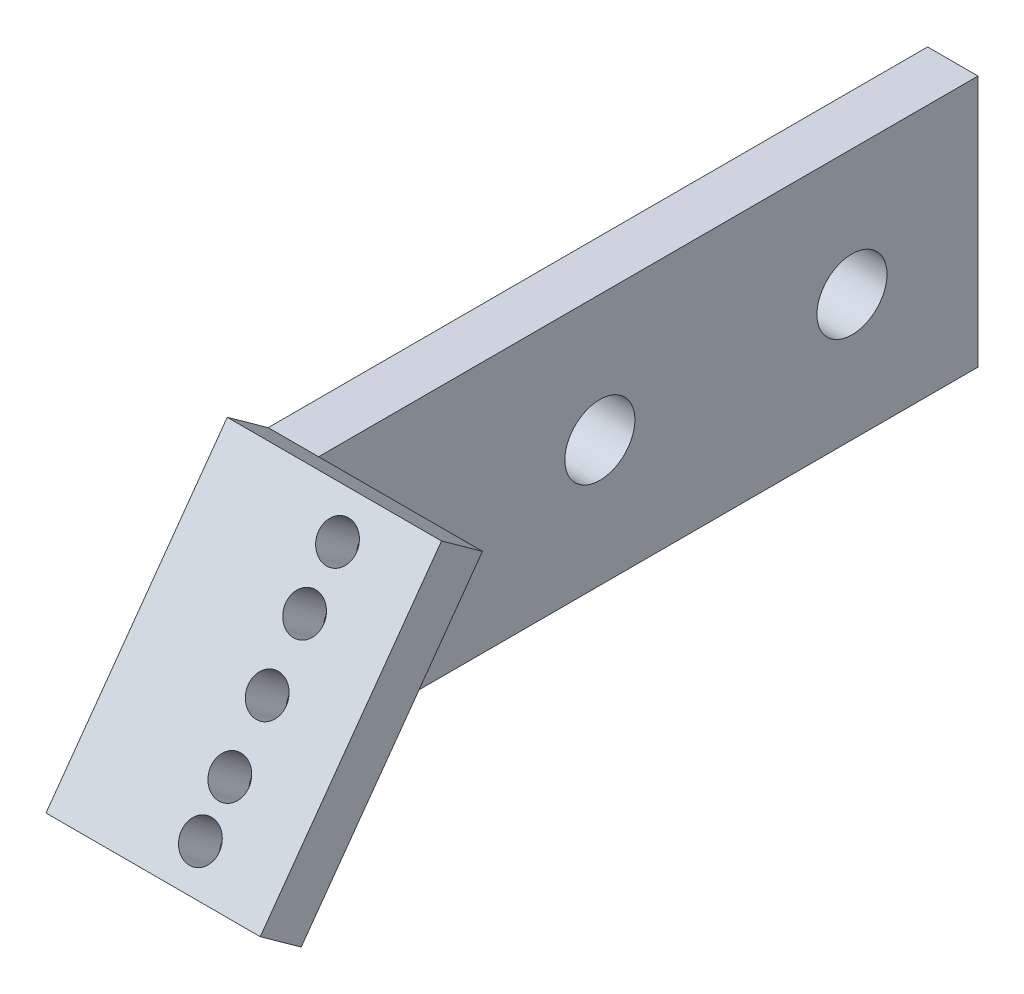
ISO-10303-21;
HEADER;
FILE_DESCRIPTION(('STEP AP214'),'2;1');
FILE_NAME('part.step','',(''),(''),'','','');
FILE_SCHEMA(('AUTOMOTIVE_DESIGN { 1 0 10303 214 1 1 1 1 }'));
ENDSEC;
DATA;
#1=APPLICATION_CONTEXT('core data for automotive mechanical design processes');
#2=APPLICATION_PROTOCOL_DEFINITION('international standard','automotive_design',2000,#1);
#3=PRODUCT_CONTEXT('',#1,'mechanical');
#4=PRODUCT('Part','Part','',(#3));
#5=PRODUCT_RELATED_PRODUCT_CATEGORY('part','',(#4));
#6=PRODUCT_DEFINITION_FORMATION('','',#4);
#7=PRODUCT_DEFINITION_CONTEXT('part definition',#1,'design');
#8=PRODUCT_DEFINITION('design','',#6,#7);
#9=PRODUCT_DEFINITION_SHAPE('','',#8);
#10=(LENGTH_UNIT() NAMED_UNIT(*) SI_UNIT(.MILLI.,.METRE.));
#11=(NAMED_UNIT(*) PLANE_ANGLE_UNIT() SI_UNIT($,.RADIAN.));
#12=(NAMED_UNIT(*) SI_UNIT($,.STERADIAN.) SOLID_ANGLE_UNIT());
#13=UNCERTAINTY_MEASURE_WITH_UNIT(LENGTH_MEASURE(1.E-05),#10,'distance_accuracy_value','');
#14=(GEOMETRIC_REPRESENTATION_CONTEXT(3) GLOBAL_UNCERTAINTY_ASSIGNED_CONTEXT((#13)) GLOBAL_UNIT_ASSIGNED_CONTEXT((#10,
#11,#12)) REPRESENTATION_CONTEXT('',''));
#15=CARTESIAN_POINT('',(0.,0.,0.));
#16=DIRECTION('',(0.,0.,1.));
#17=DIRECTION('',(1.,0.,0.));
#18=AXIS2_PLACEMENT_3D('',#15,#16,#17);
#19=CARTESIAN_POINT('',(4.,0.,0.));
#20=DIRECTION('',(1.,0.,0.));
#21=DIRECTION('',(0.,0.,-1.));
#22=AXIS2_PLACEMENT_3D('',#19,#20,#21);
#23=PLANE('',#22);
#24=CARTESIAN_POINT('',(4.,-10.,0.));
#25=DIRECTION('',(1.,0.,0.));
#26=DIRECTION('',(0.,0.,-1.));
#27=AXIS2_PLACEMENT_3D('',#24,#25,#26);
#28=CIRCLE('',#27,2.78);
#29=CARTESIAN_POINT('',(4.,-10.,-2.78));
#30=VERTEX_POINT('',#29);
#31=EDGE_CURVE('E164',#30,#30,#28,.T.);
#32=ORIENTED_EDGE('',*,*,#31,.F.);
#33=EDGE_LOOP('',(#32));
#34=FACE_BOUND('',#33,.T.);
#35=DIRECTION('',(0.,0.,1.));
#36=VECTOR('',#35,1.);
#37=CARTESIAN_POINT('',(4.,0.,10.));
#38=LINE('',#37,#36);
#39=CARTESIAN_POINT('',(4.,0.,-30.));
#40=VERTEX_POINT('',#39);
#41=CARTESIAN_POINT('',(4.,0.,22.3164970669424));
#42=VERTEX_POINT('',#41);
#43=EDGE_CURVE('E170',#40,#42,#38,.T.);
#44=ORIENTED_EDGE('',*,*,#43,.T.);
#45=DIRECTION('',(0.,0.811919163837592,-0.583769878799229));
#46=VECTOR('',#45,1.);
#47=CARTESIAN_POINT('',(4.,0.,22.3164970669424));
#48=LINE('',#47,#46);
#49=CARTESIAN_POINT('',(4.,-20.,36.6964970669424));
#50=VERTEX_POINT('',#49);
#51=EDGE_CURVE('E138',#50,#42,#48,.T.);
#52=ORIENTED_EDGE('',*,*,#51,.F.);
#53=DIRECTION('',(0.,0.,-1.));
#54=VECTOR('',#53,1.);
#55=CARTESIAN_POINT('',(4.,-20.,10.));
#56=LINE('',#55,#54);
#57=CARTESIAN_POINT('',(4.,-20.,-30.));
#58=VERTEX_POINT('',#57);
#59=EDGE_CURVE('E171',#50,#58,#56,.T.);
#60=ORIENTED_EDGE('',*,*,#59,.T.);
#61=DIRECTION('',(0.,1.,0.));
#62=VECTOR('',#61,1.);
#63=CARTESIAN_POINT('',(4.,0.,-30.));
#64=LINE('',#63,#62);
#65=EDGE_CURVE('E68',#58,#40,#64,.T.);
#66=ORIENTED_EDGE('',*,*,#65,.T.);
#67=EDGE_LOOP('',(#44,#52,#60,#66));
#68=FACE_BOUND('',#67,.T.);
#69=CARTESIAN_POINT('',(4.,-10.,-20.));
#70=DIRECTION('',(1.,0.,0.));
#71=DIRECTION('',(0.,0.,-1.));
#72=AXIS2_PLACEMENT_3D('',#69,#70,#71);
#73=CIRCLE('',#72,2.78);
#74=CARTESIAN_POINT('',(4.,-10.,-22.78));
#75=VERTEX_POINT('',#74);
#76=EDGE_CURVE('E157',#75,#75,#73,.T.);
#77=ORIENTED_EDGE('',*,*,#76,.F.);
#78=EDGE_LOOP('',(#77));
#79=FACE_BOUND('',#78,.T.);
#80=ADVANCED_FACE('F47',(#34,#68,#79),#23,.T.);
#81=CARTESIAN_POINT('',(0.,0.,0.));
#82=DIRECTION('',(1.,0.,0.));
#83=DIRECTION('',(0.,0.,-1.));
#84=AXIS2_PLACEMENT_3D('',#81,#82,#83);
#85=PLANE('',#84);
#86=DIRECTION('',(0.,0.,-1.));
#87=VECTOR('',#86,1.);
#88=CARTESIAN_POINT('',(0.,-20.,10.));
#89=LINE('',#88,#87);
#90=CARTESIAN_POINT('',(0.,-20.,36.6964970669424));
#91=VERTEX_POINT('',#90);
#92=CARTESIAN_POINT('',(0.,-20.,-30.));
#93=VERTEX_POINT('',#92);
#94=EDGE_CURVE('E79',#91,#93,#89,.T.);
#95=ORIENTED_EDGE('',*,*,#94,.F.);
#96=DIRECTION('',(0.,-0.583769878799229,-0.811919163837592));
#97=VECTOR('',#96,1.);
#98=CARTESIAN_POINT('',(0.,-17.6649204848031,39.9441737222928));
#99=LINE('',#98,#97);
#100=CARTESIAN_POINT('',(0.,-17.6649204848031,39.9441737222928));
#101=VERTEX_POINT('',#100);
#102=EDGE_CURVE('E117',#101,#91,#99,.T.);
#103=ORIENTED_EDGE('',*,*,#102,.F.);
#104=DIRECTION('',(0.,-0.811919163837592,0.583769878799229));
#105=VECTOR('',#104,1.);
#106=CARTESIAN_POINT('',(0.,2.33507951519691,25.5641737222928));
#107=LINE('',#106,#105);
#108=CARTESIAN_POINT('',(0.,2.33507951519691,25.5641737222928));
#109=VERTEX_POINT('',#108);
#110=EDGE_CURVE('E123',#109,#101,#107,.T.);
#111=ORIENTED_EDGE('',*,*,#110,.F.);
#112=DIRECTION('',(0.,-0.583769878799229,-0.811919163837592));
#113=VECTOR('',#112,1.);
#114=CARTESIAN_POINT('',(0.,2.33507951519691,25.5641737222928));
#115=LINE('',#114,#113);
#116=CARTESIAN_POINT('',(0.,0.,22.3164970669424));
#117=VERTEX_POINT('',#116);
#118=EDGE_CURVE('E278',#109,#117,#115,.T.);
#119=ORIENTED_EDGE('',*,*,#118,.T.);
#120=DIRECTION('',(0.,0.,1.));
#121=VECTOR('',#120,1.);
#122=CARTESIAN_POINT('',(0.,0.,10.));
#123=LINE('',#122,#121);
#124=CARTESIAN_POINT('',(0.,0.,-30.));
#125=VERTEX_POINT('',#124);
#126=EDGE_CURVE('E174',#125,#117,#123,.T.);
#127=ORIENTED_EDGE('',*,*,#126,.F.);
#128=DIRECTION('',(0.,1.,0.));
#129=VECTOR('',#128,1.);
#130=CARTESIAN_POINT('',(0.,0.,-30.));
#131=LINE('',#130,#129);
#132=EDGE_CURVE('E172',#93,#125,#131,.T.);
#133=ORIENTED_EDGE('',*,*,#132,.F.);
#134=EDGE_LOOP('',(#95,#103,#111,#119,#127,#133));
#135=FACE_BOUND('',#134,.T.);
#136=CARTESIAN_POINT('',(0.,-10.,0.));
#137=DIRECTION('',(1.,0.,0.));
#138=DIRECTION('',(0.,0.,-1.));
#139=AXIS2_PLACEMENT_3D('',#136,#137,#138);
#140=CIRCLE('',#139,2.78);
#141=CARTESIAN_POINT('',(0.,-10.,-2.78));
#142=VERTEX_POINT('',#141);
#143=EDGE_CURVE('E160',#142,#142,#140,.T.);
#144=ORIENTED_EDGE('',*,*,#143,.T.);
#145=EDGE_LOOP('',(#144));
#146=FACE_BOUND('',#145,.T.);
#147=CARTESIAN_POINT('',(0.,-10.,-20.));
#148=DIRECTION('',(1.,0.,0.));
#149=DIRECTION('',(0.,0.,-1.));
#150=AXIS2_PLACEMENT_3D('',#147,#148,#149);
#151=CIRCLE('',#150,2.78);
#152=CARTESIAN_POINT('',(0.,-10.,-22.78));
#153=VERTEX_POINT('',#152);
#154=EDGE_CURVE('E161',#153,#153,#151,.T.);
#155=ORIENTED_EDGE('',*,*,#154,.T.);
#156=EDGE_LOOP('',(#155));
#157=FACE_BOUND('',#156,.T.);
#158=ADVANCED_FACE('F134',(#135,#146,#157),#85,.F.);
#159=CARTESIAN_POINT('',(4.,-20.,10.));
#160=DIRECTION('',(0.,1.,0.));
#161=DIRECTION('',(0.,0.,1.));
#162=AXIS2_PLACEMENT_3D('',#159,#160,#161);
#163=PLANE('',#162);
#164=ORIENTED_EDGE('',*,*,#94,.T.);
#165=DIRECTION('',(-1.,0.,0.));
#166=VECTOR('',#165,1.);
#167=CARTESIAN_POINT('',(4.,-20.,-30.));
#168=LINE('',#167,#166);
#169=EDGE_CURVE('E12',#58,#93,#168,.T.);
#170=ORIENTED_EDGE('',*,*,#169,.F.);
#171=ORIENTED_EDGE('',*,*,#59,.F.);
#172=DIRECTION('',(1.,0.,0.));
#173=VECTOR('',#172,1.);
#174=CARTESIAN_POINT('',(0.,-20.,36.6964970669424));
#175=LINE('',#174,#173);
#176=EDGE_CURVE('E136',#91,#50,#175,.T.);
#177=ORIENTED_EDGE('',*,*,#176,.F.);
#178=EDGE_LOOP('',(#164,#170,#171,#177));
#179=FACE_BOUND('',#178,.T.);
#180=ADVANCED_FACE('F49',(#179),#163,.F.);
#181=CARTESIAN_POINT('',(4.,0.,-30.));
#182=DIRECTION('',(0.,0.,1.));
#183=DIRECTION('',(1.,0.,0.));
#184=AXIS2_PLACEMENT_3D('',#181,#182,#183);
#185=PLANE('',#184);
#186=ORIENTED_EDGE('',*,*,#132,.T.);
#187=DIRECTION('',(-1.,0.,0.));
#188=VECTOR('',#187,1.);
#189=CARTESIAN_POINT('',(4.,0.,-30.));
#190=LINE('',#189,#188);
#191=EDGE_CURVE('E59',#40,#125,#190,.T.);
#192=ORIENTED_EDGE('',*,*,#191,.F.);
#193=ORIENTED_EDGE('',*,*,#65,.F.);
#194=ORIENTED_EDGE('',*,*,#169,.T.);
#195=EDGE_LOOP('',(#186,#192,#193,#194));
#196=FACE_BOUND('',#195,.T.);
#197=ADVANCED_FACE('F209',(#196),#185,.F.);
#198=CARTESIAN_POINT('',(4.,0.,10.));
#199=DIRECTION('',(0.,-1.,0.));
#200=DIRECTION('',(0.,0.,-1.));
#201=AXIS2_PLACEMENT_3D('',#198,#199,#200);
#202=PLANE('',#201);
#203=ORIENTED_EDGE('',*,*,#126,.T.);
#204=DIRECTION('',(-1.,0.,0.));
#205=VECTOR('',#204,1.);
#206=CARTESIAN_POINT('',(0.,0.,22.3164970669424));
#207=LINE('',#206,#205);
#208=EDGE_CURVE('E52',#42,#117,#207,.T.);
#209=ORIENTED_EDGE('',*,*,#208,.F.);
#210=ORIENTED_EDGE('',*,*,#43,.F.);
#211=ORIENTED_EDGE('',*,*,#191,.T.);
#212=EDGE_LOOP('',(#203,#209,#210,#211));
#213=FACE_BOUND('',#212,.T.);
#214=ADVANCED_FACE('F199',(#213),#202,.F.);
#215=CARTESIAN_POINT('',(4.,-10.,0.));
#216=DIRECTION('',(-1.,0.,0.));
#217=DIRECTION('',(0.,0.,1.));
#218=AXIS2_PLACEMENT_3D('',#215,#216,#217);
#219=CYLINDRICAL_SURFACE('',#218,2.78);
#220=ORIENTED_EDGE('',*,*,#31,.T.);
#221=EDGE_LOOP('',(#220));
#222=FACE_BOUND('',#221,.T.);
#223=ORIENTED_EDGE('',*,*,#143,.F.);
#224=EDGE_LOOP('',(#223));
#225=FACE_BOUND('',#224,.T.);
#226=ADVANCED_FACE('F208',(#222,#225),#219,.F.);
#227=CARTESIAN_POINT('',(4.,-10.,-20.));
#228=DIRECTION('',(-1.,0.,0.));
#229=DIRECTION('',(0.,0.,1.));
#230=AXIS2_PLACEMENT_3D('',#227,#228,#229);
#231=CYLINDRICAL_SURFACE('',#230,2.78);
#232=ORIENTED_EDGE('',*,*,#76,.T.);
#233=EDGE_LOOP('',(#232));
#234=FACE_BOUND('',#233,.T.);
#235=ORIENTED_EDGE('',*,*,#154,.F.);
#236=EDGE_LOOP('',(#235));
#237=FACE_BOUND('',#236,.T.);
#238=ADVANCED_FACE('F225',(#234,#237),#231,.F.);
#239=CARTESIAN_POINT('',(0.,12.9125178218716,17.9589955797936));
#240=DIRECTION('',(0.,0.583769878799229,0.811919163837592));
#241=DIRECTION('',(0.,-0.811919163837592,0.583769878799229));
#242=AXIS2_PLACEMENT_3D('',#239,#240,#241);
#243=PLANE('',#242);
#244=CARTESIAN_POINT('',(10.5,-15.2291629932903,38.1928640858951));
#245=DIRECTION('',(0.,0.583769878799229,0.811919163837592));
#246=DIRECTION('',(0.,-0.811919163837592,0.583769878799229));
#247=AXIS2_PLACEMENT_3D('',#244,#245,#246);
#248=CIRCLE('',#247,1.5);
#249=CARTESIAN_POINT('',(10.5,-16.4470417390467,39.0685189040939));
#250=VERTEX_POINT('',#249);
#251=EDGE_CURVE('E303',#250,#250,#248,.T.);
#252=ORIENTED_EDGE('',*,*,#251,.F.);
#253=EDGE_LOOP('',(#252));
#254=FACE_BOUND('',#253,.T.);
#255=CARTESIAN_POINT('',(10.5,-7.85693698564498,32.8922335863981));
#256=DIRECTION('',(0.,0.583769878799229,0.811919163837592));
#257=DIRECTION('',(0.,-0.811919163837592,0.583769878799229));
#258=AXIS2_PLACEMENT_3D('',#255,#256,#257);
#259=CIRCLE('',#258,1.5);
#260=CARTESIAN_POINT('',(10.5,-9.07481573140137,33.7678884045969));
#261=VERTEX_POINT('',#260);
#262=EDGE_CURVE('E292',#261,#261,#259,.T.);
#263=ORIENTED_EDGE('',*,*,#262,.F.);
#264=EDGE_LOOP('',(#263));
#265=FACE_BOUND('',#264,.T.);
#266=ORIENTED_EDGE('',*,*,#110,.T.);
#267=DIRECTION('',(1.,0.,0.));
#268=VECTOR('',#267,1.);
#269=CARTESIAN_POINT('',(0.,-17.6649204848031,39.9441737222928));
#270=LINE('',#269,#268);
#271=CARTESIAN_POINT('',(17.,-17.6649204848031,39.9441737222928));
#272=VERTEX_POINT('',#271);
#273=EDGE_CURVE('E113',#101,#272,#270,.T.);
#274=ORIENTED_EDGE('',*,*,#273,.T.);
#275=DIRECTION('',(0.,0.811919163837592,-0.583769878799229));
#276=VECTOR('',#275,1.);
#277=CARTESIAN_POINT('',(17.,2.33507951519691,25.5641737222928));
#278=LINE('',#277,#276);
#279=CARTESIAN_POINT('',(17.,2.33507951519691,25.5641737222928));
#280=VERTEX_POINT('',#279);
#281=EDGE_CURVE('E122',#272,#280,#278,.T.);
#282=ORIENTED_EDGE('',*,*,#281,.T.);
#283=DIRECTION('',(-1.,0.,0.));
#284=VECTOR('',#283,1.);
#285=CARTESIAN_POINT('',(0.,2.33507951519691,25.5641737222928));
#286=LINE('',#285,#284);
#287=EDGE_CURVE('E129',#280,#109,#286,.T.);
#288=ORIENTED_EDGE('',*,*,#287,.T.);
#289=EDGE_LOOP('',(#266,#274,#282,#288));
#290=FACE_BOUND('',#289,.T.);
#291=CARTESIAN_POINT('',(10.5,-3.73238763335002,29.926682602098));
#292=DIRECTION('',(0.,0.583769878799229,0.811919163837592));
#293=DIRECTION('',(0.,-0.811919163837592,0.583769878799229));
#294=AXIS2_PLACEMENT_3D('',#291,#292,#293);
#295=CIRCLE('',#294,1.5);
#296=CARTESIAN_POINT('',(10.5,-4.9502663791064,30.8023374202968));
#297=VERTEX_POINT('',#296);
#298=EDGE_CURVE('E264',#297,#297,#295,.T.);
#299=ORIENTED_EDGE('',*,*,#298,.F.);
#300=EDGE_LOOP('',(#299));
#301=FACE_BOUND('',#300,.T.);
#302=CARTESIAN_POINT('',(10.5,-11.98148633794,35.8577845706982));
#303=DIRECTION('',(0.,0.583769878799229,0.811919163837592));
#304=DIRECTION('',(0.,-0.811919163837592,0.583769878799229));
#305=AXIS2_PLACEMENT_3D('',#302,#303,#304);
#306=CIRCLE('',#305,1.5);
#307=CARTESIAN_POINT('',(10.5,-13.1993650836963,36.733439388897));
#308=VERTEX_POINT('',#307);
#309=EDGE_CURVE('E297',#308,#308,#306,.T.);
#310=ORIENTED_EDGE('',*,*,#309,.F.);
#311=EDGE_LOOP('',(#310));
#312=FACE_BOUND('',#311,.T.);
#313=CARTESIAN_POINT('',(10.5,-0.100677976315858,27.3154833586904));
#314=DIRECTION('',(0.,0.583769878799229,0.811919163837592));
#315=DIRECTION('',(0.,-0.811919163837592,0.583769878799229));
#316=AXIS2_PLACEMENT_3D('',#313,#314,#315);
#317=CIRCLE('',#316,1.5);
#318=CARTESIAN_POINT('',(10.5,-1.31855672207224,28.1911381768893));
#319=VERTEX_POINT('',#318);
#320=EDGE_CURVE('E309',#319,#319,#317,.T.);
#321=ORIENTED_EDGE('',*,*,#320,.F.);
#322=EDGE_LOOP('',(#321));
#323=FACE_BOUND('',#322,.T.);
#324=ADVANCED_FACE('F126',(#254,#265,#290,#301,#312,#323),#243,.T.);
#325=CARTESIAN_POINT('',(0.,10.5774383066747,14.7113189244433));
#326=DIRECTION('',(0.,0.583769878799229,0.811919163837592));
#327=DIRECTION('',(0.,-0.811919163837592,0.583769878799229));
#328=AXIS2_PLACEMENT_3D('',#325,#326,#327);
#329=PLANE('',#328);
#330=ORIENTED_EDGE('',*,*,#51,.T.);
#331=DIRECTION('',(-1.,0.,0.));
#332=VECTOR('',#331,1.);
#333=CARTESIAN_POINT('',(0.,0.,22.3164970669424));
#334=LINE('',#333,#332);
#335=CARTESIAN_POINT('',(17.,0.,22.3164970669424));
#336=VERTEX_POINT('',#335);
#337=EDGE_CURVE('E132',#336,#42,#334,.T.);
#338=ORIENTED_EDGE('',*,*,#337,.F.);
#339=DIRECTION('',(0.,0.811919163837592,-0.583769878799229));
#340=VECTOR('',#339,1.);
#341=CARTESIAN_POINT('',(17.,0.,22.3164970669424));
#342=LINE('',#341,#340);
#343=CARTESIAN_POINT('',(17.,-20.,36.6964970669424));
#344=VERTEX_POINT('',#343);
#345=EDGE_CURVE('E263',#344,#336,#342,.T.);
#346=ORIENTED_EDGE('',*,*,#345,.F.);
#347=DIRECTION('',(1.,0.,0.));
#348=VECTOR('',#347,1.);
#349=CARTESIAN_POINT('',(0.,-20.,36.6964970669424));
#350=LINE('',#349,#348);
#351=EDGE_CURVE('E255',#50,#344,#350,.T.);
#352=ORIENTED_EDGE('',*,*,#351,.F.);
#353=EDGE_LOOP('',(#330,#338,#346,#352));
#354=FACE_BOUND('',#353,.T.);
#355=CARTESIAN_POINT('',(10.5,-6.06746714854693,26.6790059467476));
#356=DIRECTION('',(0.,0.583769878799229,0.811919163837592));
#357=DIRECTION('',(0.,-0.811919163837592,0.583769878799229));
#358=AXIS2_PLACEMENT_3D('',#355,#356,#357);
#359=CIRCLE('',#358,1.5);
#360=CARTESIAN_POINT('',(10.5,-7.28534589430332,27.5546607649465));
#361=VERTEX_POINT('',#360);
#362=EDGE_CURVE('E267',#361,#361,#359,.T.);
#363=ORIENTED_EDGE('',*,*,#362,.T.);
#364=EDGE_LOOP('',(#363));
#365=FACE_BOUND('',#364,.T.);
#366=CARTESIAN_POINT('',(10.5,-10.1920165008419,29.6445569310477));
#367=DIRECTION('',(0.,0.583769878799229,0.811919163837592));
#368=DIRECTION('',(0.,-0.811919163837592,0.583769878799229));
#369=AXIS2_PLACEMENT_3D('',#366,#367,#368);
#370=CIRCLE('',#369,1.5);
#371=CARTESIAN_POINT('',(10.5,-11.4098952465983,30.5202117492466));
#372=VERTEX_POINT('',#371);
#373=EDGE_CURVE('E294',#372,#372,#370,.T.);
#374=ORIENTED_EDGE('',*,*,#373,.T.);
#375=EDGE_LOOP('',(#374));
#376=FACE_BOUND('',#375,.T.);
#377=CARTESIAN_POINT('',(10.5,-14.3165658531369,32.6101079153478));
#378=DIRECTION('',(0.,0.583769878799229,0.811919163837592));
#379=DIRECTION('',(0.,-0.811919163837592,0.583769878799229));
#380=AXIS2_PLACEMENT_3D('',#377,#378,#379);
#381=CIRCLE('',#380,1.5);
#382=CARTESIAN_POINT('',(10.5,-15.5344445988933,33.4857627335466));
#383=VERTEX_POINT('',#382);
#384=EDGE_CURVE('E300',#383,#383,#381,.T.);
#385=ORIENTED_EDGE('',*,*,#384,.T.);
#386=EDGE_LOOP('',(#385));
#387=FACE_BOUND('',#386,.T.);
#388=CARTESIAN_POINT('',(10.5,-17.5642425084872,34.9451874305447));
#389=DIRECTION('',(0.,0.583769878799229,0.811919163837592));
#390=DIRECTION('',(0.,-0.811919163837592,0.583769878799229));
#391=AXIS2_PLACEMENT_3D('',#388,#389,#390);
#392=CIRCLE('',#391,1.5);
#393=CARTESIAN_POINT('',(10.5,-18.7821212542436,35.8208422487436));
#394=VERTEX_POINT('',#393);
#395=EDGE_CURVE('E306',#394,#394,#392,.T.);
#396=ORIENTED_EDGE('',*,*,#395,.T.);
#397=EDGE_LOOP('',(#396));
#398=FACE_BOUND('',#397,.T.);
#399=CARTESIAN_POINT('',(10.5,-2.43575749151277,24.0678067033401));
#400=DIRECTION('',(0.,0.583769878799229,0.811919163837592));
#401=DIRECTION('',(0.,-0.811919163837592,0.583769878799229));
#402=AXIS2_PLACEMENT_3D('',#399,#400,#401);
#403=CIRCLE('',#402,1.5);
#404=CARTESIAN_POINT('',(10.5,-3.65363623726916,24.9434615215389));
#405=VERTEX_POINT('',#404);
#406=EDGE_CURVE('E312',#405,#405,#403,.T.);
#407=ORIENTED_EDGE('',*,*,#406,.T.);
#408=EDGE_LOOP('',(#407));
#409=FACE_BOUND('',#408,.T.);
#410=ADVANCED_FACE('F233',(#354,#365,#376,#387,#398,#409),#329,.F.);
#411=CARTESIAN_POINT('',(0.,-17.6649204848031,39.9441737222928));
#412=DIRECTION('',(0.,0.811919163837592,-0.583769878799229));
#413=DIRECTION('',(0.,0.583769878799229,0.811919163837592));
#414=AXIS2_PLACEMENT_3D('',#411,#412,#413);
#415=PLANE('',#414);
#416=ORIENTED_EDGE('',*,*,#176,.T.);
#417=ORIENTED_EDGE('',*,*,#351,.T.);
#418=DIRECTION('',(0.,-0.583769878799229,-0.811919163837592));
#419=VECTOR('',#418,1.);
#420=CARTESIAN_POINT('',(17.,-17.6649204848031,39.9441737222928));
#421=LINE('',#420,#419);
#422=EDGE_CURVE('E119',#272,#344,#421,.T.);
#423=ORIENTED_EDGE('',*,*,#422,.F.);
#424=ORIENTED_EDGE('',*,*,#273,.F.);
#425=ORIENTED_EDGE('',*,*,#102,.T.);
#426=EDGE_LOOP('',(#416,#417,#423,#424,#425));
#427=FACE_BOUND('',#426,.T.);
#428=ADVANCED_FACE('F116',(#427),#415,.F.);
#429=CARTESIAN_POINT('',(17.,2.33507951519691,25.5641737222928));
#430=DIRECTION('',(-1.,0.,0.));
#431=DIRECTION('',(0.,-1.,0.));
#432=AXIS2_PLACEMENT_3D('',#429,#430,#431);
#433=PLANE('',#432);
#434=ORIENTED_EDGE('',*,*,#345,.T.);
#435=DIRECTION('',(0.,-0.583769878799229,-0.811919163837592));
#436=VECTOR('',#435,1.);
#437=CARTESIAN_POINT('',(17.,2.33507951519691,25.5641737222928));
#438=LINE('',#437,#436);
#439=EDGE_CURVE('E139',#280,#336,#438,.T.);
#440=ORIENTED_EDGE('',*,*,#439,.F.);
#441=ORIENTED_EDGE('',*,*,#281,.F.);
#442=ORIENTED_EDGE('',*,*,#422,.T.);
#443=EDGE_LOOP('',(#434,#440,#441,#442));
#444=FACE_BOUND('',#443,.T.);
#445=ADVANCED_FACE('F232',(#444),#433,.F.);
#446=CARTESIAN_POINT('',(0.,2.33507951519691,25.5641737222928));
#447=DIRECTION('',(0.,-0.811919163837592,0.583769878799229));
#448=DIRECTION('',(0.,-0.583769878799229,-0.811919163837592));
#449=AXIS2_PLACEMENT_3D('',#446,#447,#448);
#450=PLANE('',#449);
#451=ORIENTED_EDGE('',*,*,#337,.T.);
#452=ORIENTED_EDGE('',*,*,#208,.T.);
#453=ORIENTED_EDGE('',*,*,#118,.F.);
#454=ORIENTED_EDGE('',*,*,#287,.F.);
#455=ORIENTED_EDGE('',*,*,#439,.T.);
#456=EDGE_LOOP('',(#451,#452,#453,#454,#455));
#457=FACE_BOUND('',#456,.T.);
#458=ADVANCED_FACE('F236',(#457),#450,.F.);
#459=CARTESIAN_POINT('',(10.5,-3.73238763335002,29.926682602098));
#460=DIRECTION('',(0.,-0.583769878799229,-0.811919163837592));
#461=DIRECTION('',(0.,0.811919163837592,-0.583769878799229));
#462=AXIS2_PLACEMENT_3D('',#459,#460,#461);
#463=CYLINDRICAL_SURFACE('',#462,1.5);
#464=ORIENTED_EDGE('',*,*,#298,.T.);
#465=EDGE_LOOP('',(#464));
#466=FACE_BOUND('',#465,.T.);
#467=ORIENTED_EDGE('',*,*,#362,.F.);
#468=EDGE_LOOP('',(#467));
#469=FACE_BOUND('',#468,.T.);
#470=ADVANCED_FACE('F241',(#466,#469),#463,.F.);
#471=CARTESIAN_POINT('',(10.5,-7.85693698564498,32.8922335863981));
#472=DIRECTION('',(0.,-0.583769878799229,-0.811919163837592));
#473=DIRECTION('',(0.,0.811919163837592,-0.583769878799229));
#474=AXIS2_PLACEMENT_3D('',#471,#472,#473);
#475=CYLINDRICAL_SURFACE('',#474,1.5);
#476=ORIENTED_EDGE('',*,*,#262,.T.);
#477=EDGE_LOOP('',(#476));
#478=FACE_BOUND('',#477,.T.);
#479=ORIENTED_EDGE('',*,*,#373,.F.);
#480=EDGE_LOOP('',(#479));
#481=FACE_BOUND('',#480,.T.);
#482=ADVANCED_FACE('F331',(#478,#481),#475,.F.);
#483=CARTESIAN_POINT('',(10.5,-11.98148633794,35.8577845706982));
#484=DIRECTION('',(0.,-0.583769878799229,-0.811919163837592));
#485=DIRECTION('',(0.,0.811919163837592,-0.583769878799229));
#486=AXIS2_PLACEMENT_3D('',#483,#484,#485);
#487=CYLINDRICAL_SURFACE('',#486,1.5);
#488=ORIENTED_EDGE('',*,*,#309,.T.);
#489=EDGE_LOOP('',(#488));
#490=FACE_BOUND('',#489,.T.);
#491=ORIENTED_EDGE('',*,*,#384,.F.);
#492=EDGE_LOOP('',(#491));
#493=FACE_BOUND('',#492,.T.);
#494=ADVANCED_FACE('F335',(#490,#493),#487,.F.);
#495=CARTESIAN_POINT('',(10.5,-15.2291629932903,38.1928640858951));
#496=DIRECTION('',(0.,-0.583769878799229,-0.811919163837592));
#497=DIRECTION('',(0.,0.811919163837592,-0.583769878799229));
#498=AXIS2_PLACEMENT_3D('',#495,#496,#497);
#499=CYLINDRICAL_SURFACE('',#498,1.5);
#500=ORIENTED_EDGE('',*,*,#251,.T.);
#501=EDGE_LOOP('',(#500));
#502=FACE_BOUND('',#501,.T.);
#503=ORIENTED_EDGE('',*,*,#395,.F.);
#504=EDGE_LOOP('',(#503));
#505=FACE_BOUND('',#504,.T.);
#506=ADVANCED_FACE('F339',(#502,#505),#499,.F.);
#507=CARTESIAN_POINT('',(10.5,-0.100677976315858,27.3154833586904));
#508=DIRECTION('',(0.,-0.583769878799229,-0.811919163837592));
#509=DIRECTION('',(0.,0.811919163837592,-0.583769878799229));
#510=AXIS2_PLACEMENT_3D('',#507,#508,#509);
#511=CYLINDRICAL_SURFACE('',#510,1.5);
#512=ORIENTED_EDGE('',*,*,#320,.T.);
#513=EDGE_LOOP('',(#512));
#514=FACE_BOUND('',#513,.T.);
#515=ORIENTED_EDGE('',*,*,#406,.F.);
#516=EDGE_LOOP('',(#515));
#517=FACE_BOUND('',#516,.T.);
#518=ADVANCED_FACE('F318',(#514,#517),#511,.F.);
#519=CLOSED_SHELL('',(#80,#158,#180,#197,#214,#226,#238,#324,#410,#428,#445,#458,#470,#482,#494,
#506,#518));
#520=MANIFOLD_SOLID_BREP('B2',#519);
#521=ADVANCED_BREP_SHAPE_REPRESENTATION('',(#18,#520),#14);
#522=SHAPE_DEFINITION_REPRESENTATION(#9,#521);
ENDSEC;
END-ISO-10303-21;
